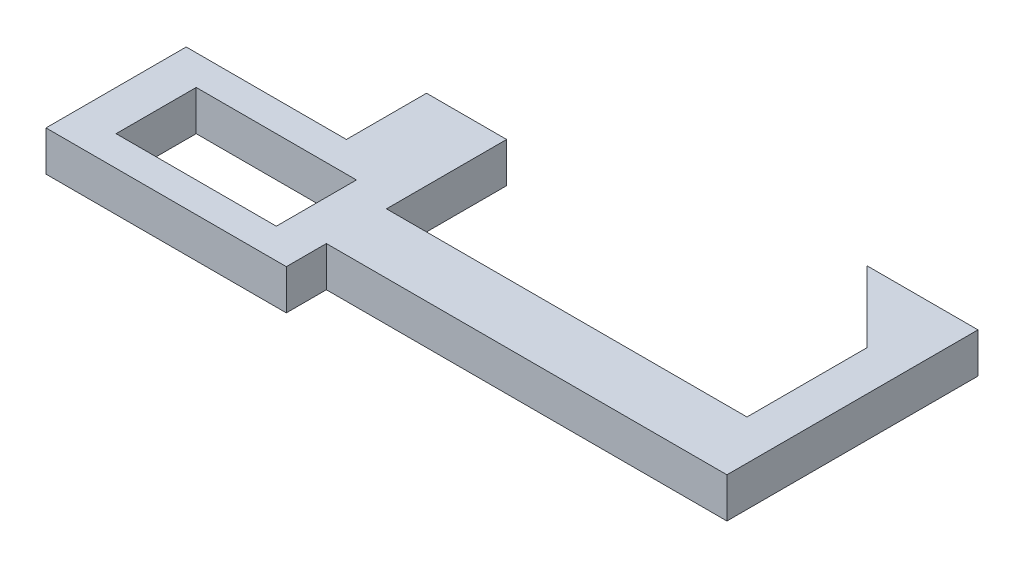
ISO-10303-21;
HEADER;
FILE_DESCRIPTION(('STEP AP214'),'2;1');
FILE_NAME('part.step','',(''),(''),'','','');
FILE_SCHEMA(('AUTOMOTIVE_DESIGN { 1 0 10303 214 1 1 1 1 }'));
ENDSEC;
DATA;
#1=APPLICATION_CONTEXT('core data for automotive mechanical design processes');
#2=APPLICATION_PROTOCOL_DEFINITION('international standard','automotive_design',2000,#1);
#3=PRODUCT_CONTEXT('',#1,'mechanical');
#4=PRODUCT('Part','Part','',(#3));
#5=PRODUCT_RELATED_PRODUCT_CATEGORY('part','',(#4));
#6=PRODUCT_DEFINITION_FORMATION('','',#4);
#7=PRODUCT_DEFINITION_CONTEXT('part definition',#1,'design');
#8=PRODUCT_DEFINITION('design','',#6,#7);
#9=PRODUCT_DEFINITION_SHAPE('','',#8);
#10=(LENGTH_UNIT() NAMED_UNIT(*) SI_UNIT(.MILLI.,.METRE.));
#11=(NAMED_UNIT(*) PLANE_ANGLE_UNIT() SI_UNIT($,.RADIAN.));
#12=(NAMED_UNIT(*) SI_UNIT($,.STERADIAN.) SOLID_ANGLE_UNIT());
#13=UNCERTAINTY_MEASURE_WITH_UNIT(LENGTH_MEASURE(1.E-05),#10,'distance_accuracy_value','');
#14=(GEOMETRIC_REPRESENTATION_CONTEXT(3) GLOBAL_UNCERTAINTY_ASSIGNED_CONTEXT((#13)) GLOBAL_UNIT_ASSIGNED_CONTEXT((#10,
#11,#12)) REPRESENTATION_CONTEXT('',''));
#15=CARTESIAN_POINT('',(0.,0.,0.));
#16=DIRECTION('',(0.,0.,1.));
#17=DIRECTION('',(1.,0.,0.));
#18=AXIS2_PLACEMENT_3D('',#15,#16,#17);
#19=CARTESIAN_POINT('',(0.,0.5,-22.6921827779806));
#20=DIRECTION('',(0.,0.,1.));
#21=DIRECTION('',(1.,0.,0.));
#22=AXIS2_PLACEMENT_3D('',#19,#20,#21);
#23=PLANE('',#22);
#24=DIRECTION('',(-1.,0.,0.));
#25=VECTOR('',#24,1.);
#26=CARTESIAN_POINT('',(0.,0.,-22.6921827779806));
#27=LINE('',#26,#25);
#28=CARTESIAN_POINT('',(-28.9732967707679,0.,-22.6921827779806));
#29=VERTEX_POINT('',#28);
#30=CARTESIAN_POINT('',(-30.9732967707679,0.,-22.6921827779806));
#31=VERTEX_POINT('',#30);
#32=EDGE_CURVE('E304',#29,#31,#27,.T.);
#33=ORIENTED_EDGE('',*,*,#32,.T.);
#34=DIRECTION('',(0.,-1.,0.));
#35=VECTOR('',#34,1.);
#36=CARTESIAN_POINT('',(-30.9732967707679,0.5,-22.6921827779806));
#37=LINE('',#36,#35);
#38=CARTESIAN_POINT('',(-30.9732967707679,0.5,-22.6921827779806));
#39=VERTEX_POINT('',#38);
#40=EDGE_CURVE('E11',#39,#31,#37,.T.);
#41=ORIENTED_EDGE('',*,*,#40,.F.);
#42=DIRECTION('',(-1.,0.,0.));
#43=VECTOR('',#42,1.);
#44=CARTESIAN_POINT('',(0.,0.5,-22.6921827779806));
#45=LINE('',#44,#43);
#46=CARTESIAN_POINT('',(-28.9732967707679,0.5,-22.6921827779806));
#47=VERTEX_POINT('',#46);
#48=EDGE_CURVE('E215',#47,#39,#45,.T.);
#49=ORIENTED_EDGE('',*,*,#48,.F.);
#50=DIRECTION('',(0.,-1.,0.));
#51=VECTOR('',#50,1.);
#52=CARTESIAN_POINT('',(-28.9732967707679,0.5,-22.6921827779806));
#53=LINE('',#52,#51);
#54=EDGE_CURVE('E239',#47,#29,#53,.T.);
#55=ORIENTED_EDGE('',*,*,#54,.T.);
#56=EDGE_LOOP('',(#33,#41,#49,#55));
#57=FACE_BOUND('',#56,.T.);
#58=ADVANCED_FACE('F41',(#57),#23,.F.);
#59=CARTESIAN_POINT('',(-30.9732967707679,0.5,0.));
#60=DIRECTION('',(-1.,0.,0.));
#61=DIRECTION('',(0.,0.,1.));
#62=AXIS2_PLACEMENT_3D('',#59,#60,#61);
#63=PLANE('',#62);
#64=DIRECTION('',(0.,0.,-1.));
#65=VECTOR('',#64,1.);
#66=CARTESIAN_POINT('',(-30.9732967707679,0.,0.));
#67=LINE('',#66,#65);
#68=CARTESIAN_POINT('',(-30.9732967707679,0.,-20.9421827779806));
#69=VERTEX_POINT('',#68);
#70=EDGE_CURVE('E308',#69,#31,#67,.T.);
#71=ORIENTED_EDGE('',*,*,#70,.F.);
#72=DIRECTION('',(0.,-1.,0.));
#73=VECTOR('',#72,1.);
#74=CARTESIAN_POINT('',(-30.9732967707679,0.5,-20.9421827779806));
#75=LINE('',#74,#73);
#76=CARTESIAN_POINT('',(-30.9732967707679,0.5,-20.9421827779806));
#77=VERTEX_POINT('',#76);
#78=EDGE_CURVE('E52',#77,#69,#75,.T.);
#79=ORIENTED_EDGE('',*,*,#78,.F.);
#80=DIRECTION('',(0.,0.,-1.));
#81=VECTOR('',#80,1.);
#82=CARTESIAN_POINT('',(-30.9732967707679,0.5,0.));
#83=LINE('',#82,#81);
#84=EDGE_CURVE('E210',#77,#39,#83,.T.);
#85=ORIENTED_EDGE('',*,*,#84,.T.);
#86=ORIENTED_EDGE('',*,*,#40,.T.);
#87=EDGE_LOOP('',(#71,#79,#85,#86));
#88=FACE_BOUND('',#87,.T.);
#89=ADVANCED_FACE('F367',(#88),#63,.T.);
#90=CARTESIAN_POINT('',(0.,0.5,-20.9421827779806));
#91=DIRECTION('',(0.,0.,1.));
#92=DIRECTION('',(1.,0.,0.));
#93=AXIS2_PLACEMENT_3D('',#90,#91,#92);
#94=PLANE('',#93);
#95=DIRECTION('',(-1.,0.,0.));
#96=VECTOR('',#95,1.);
#97=CARTESIAN_POINT('',(0.,0.,-20.9421827779806));
#98=LINE('',#97,#96);
#99=CARTESIAN_POINT('',(-27.9732967707679,0.,-20.9421827779806));
#100=VERTEX_POINT('',#99);
#101=EDGE_CURVE('E312',#100,#69,#98,.T.);
#102=ORIENTED_EDGE('',*,*,#101,.F.);
#103=DIRECTION('',(0.,-1.,0.));
#104=VECTOR('',#103,1.);
#105=CARTESIAN_POINT('',(-27.9732967707679,0.5,-20.9421827779806));
#106=LINE('',#105,#104);
#107=CARTESIAN_POINT('',(-27.9732967707679,0.5,-20.9421827779806));
#108=VERTEX_POINT('',#107);
#109=EDGE_CURVE('E264',#108,#100,#106,.T.);
#110=ORIENTED_EDGE('',*,*,#109,.F.);
#111=DIRECTION('',(-1.,0.,0.));
#112=VECTOR('',#111,1.);
#113=CARTESIAN_POINT('',(0.,0.5,-20.9421827779806));
#114=LINE('',#113,#112);
#115=EDGE_CURVE('E203',#108,#77,#114,.T.);
#116=ORIENTED_EDGE('',*,*,#115,.T.);
#117=ORIENTED_EDGE('',*,*,#78,.T.);
#118=EDGE_LOOP('',(#102,#110,#116,#117));
#119=FACE_BOUND('',#118,.T.);
#120=ADVANCED_FACE('F372',(#119),#94,.T.);
#121=CARTESIAN_POINT('',(-27.9732967707679,0.5,0.));
#122=DIRECTION('',(1.,0.,0.));
#123=DIRECTION('',(0.,0.,-1.));
#124=AXIS2_PLACEMENT_3D('',#121,#122,#123);
#125=PLANE('',#124);
#126=DIRECTION('',(0.,0.,1.));
#127=VECTOR('',#126,1.);
#128=CARTESIAN_POINT('',(-27.9732967707679,0.,0.));
#129=LINE('',#128,#127);
#130=CARTESIAN_POINT('',(-27.9732967707679,0.,-21.4421827779806));
#131=VERTEX_POINT('',#130);
#132=EDGE_CURVE('E316',#131,#100,#129,.T.);
#133=ORIENTED_EDGE('',*,*,#132,.F.);
#134=DIRECTION('',(0.,-1.,0.));
#135=VECTOR('',#134,1.);
#136=CARTESIAN_POINT('',(-27.9732967707679,0.5,-21.4421827779806));
#137=LINE('',#136,#135);
#138=CARTESIAN_POINT('',(-27.9732967707679,0.5,-21.4421827779806));
#139=VERTEX_POINT('',#138);
#140=EDGE_CURVE('E261',#139,#131,#137,.T.);
#141=ORIENTED_EDGE('',*,*,#140,.F.);
#142=DIRECTION('',(0.,0.,1.));
#143=VECTOR('',#142,1.);
#144=CARTESIAN_POINT('',(-27.9732967707679,0.5,0.));
#145=LINE('',#144,#143);
#146=EDGE_CURVE('E194',#139,#108,#145,.T.);
#147=ORIENTED_EDGE('',*,*,#146,.T.);
#148=ORIENTED_EDGE('',*,*,#109,.T.);
#149=EDGE_LOOP('',(#133,#141,#147,#148));
#150=FACE_BOUND('',#149,.T.);
#151=ADVANCED_FACE('F390',(#150),#125,.T.);
#152=CARTESIAN_POINT('',(0.,0.5,-21.4421827779806));
#153=DIRECTION('',(0.,0.,-1.));
#154=DIRECTION('',(-1.,0.,0.));
#155=AXIS2_PLACEMENT_3D('',#152,#153,#154);
#156=PLANE('',#155);
#157=DIRECTION('',(1.,0.,0.));
#158=VECTOR('',#157,1.);
#159=CARTESIAN_POINT('',(0.,0.,-21.4421827779806));
#160=LINE('',#159,#158);
#161=CARTESIAN_POINT('',(-22.9732967707679,0.,-21.4421827779806));
#162=VERTEX_POINT('',#161);
#163=EDGE_CURVE('E320',#131,#162,#160,.T.);
#164=ORIENTED_EDGE('',*,*,#163,.T.);
#165=DIRECTION('',(0.,-1.,0.));
#166=VECTOR('',#165,1.);
#167=CARTESIAN_POINT('',(-22.9732967707679,0.5,-21.4421827779806));
#168=LINE('',#167,#166);
#169=CARTESIAN_POINT('',(-22.9732967707679,0.5,-21.4421827779806));
#170=VERTEX_POINT('',#169);
#171=EDGE_CURVE('E258',#170,#162,#168,.T.);
#172=ORIENTED_EDGE('',*,*,#171,.F.);
#173=DIRECTION('',(1.,0.,0.));
#174=VECTOR('',#173,1.);
#175=CARTESIAN_POINT('',(0.,0.5,-21.4421827779806));
#176=LINE('',#175,#174);
#177=EDGE_CURVE('E202',#139,#170,#176,.T.);
#178=ORIENTED_EDGE('',*,*,#177,.F.);
#179=ORIENTED_EDGE('',*,*,#140,.T.);
#180=EDGE_LOOP('',(#164,#172,#178,#179));
#181=FACE_BOUND('',#180,.T.);
#182=ADVANCED_FACE('F410',(#181),#156,.F.);
#183=CARTESIAN_POINT('',(-22.9732967707679,0.5,0.));
#184=DIRECTION('',(1.,0.,0.));
#185=DIRECTION('',(0.,0.,-1.));
#186=AXIS2_PLACEMENT_3D('',#183,#184,#185);
#187=PLANE('',#186);
#188=DIRECTION('',(0.,0.,1.));
#189=VECTOR('',#188,1.);
#190=CARTESIAN_POINT('',(-22.9732967707679,0.,0.));
#191=LINE('',#190,#189);
#192=CARTESIAN_POINT('',(-22.9732967707679,0.,-24.5760662544638));
#193=VERTEX_POINT('',#192);
#194=EDGE_CURVE('E324',#193,#162,#191,.T.);
#195=ORIENTED_EDGE('',*,*,#194,.F.);
#196=DIRECTION('',(0.,-1.,0.));
#197=VECTOR('',#196,1.);
#198=CARTESIAN_POINT('',(-22.9732967707679,0.5,-24.5760662544638));
#199=LINE('',#198,#197);
#200=CARTESIAN_POINT('',(-22.9732967707679,0.5,-24.5760662544638));
#201=VERTEX_POINT('',#200);
#202=EDGE_CURVE('E255',#201,#193,#199,.T.);
#203=ORIENTED_EDGE('',*,*,#202,.F.);
#204=DIRECTION('',(0.,0.,1.));
#205=VECTOR('',#204,1.);
#206=CARTESIAN_POINT('',(-22.9732967707679,0.5,0.));
#207=LINE('',#206,#205);
#208=EDGE_CURVE('E208',#201,#170,#207,.T.);
#209=ORIENTED_EDGE('',*,*,#208,.T.);
#210=ORIENTED_EDGE('',*,*,#171,.T.);
#211=EDGE_LOOP('',(#195,#203,#209,#210));
#212=FACE_BOUND('',#211,.T.);
#213=ADVANCED_FACE('F406',(#212),#187,.T.);
#214=CARTESIAN_POINT('',(0.,0.5,-24.5760662544638));
#215=DIRECTION('',(0.,0.,-1.));
#216=DIRECTION('',(-1.,0.,0.));
#217=AXIS2_PLACEMENT_3D('',#214,#215,#216);
#218=PLANE('',#217);
#219=DIRECTION('',(1.,0.,0.));
#220=VECTOR('',#219,1.);
#221=CARTESIAN_POINT('',(0.,0.,-24.5760662544638));
#222=LINE('',#221,#220);
#223=CARTESIAN_POINT('',(-24.3571802472511,0.,-24.5760662544638));
#224=VERTEX_POINT('',#223);
#225=EDGE_CURVE('E328',#224,#193,#222,.T.);
#226=ORIENTED_EDGE('',*,*,#225,.F.);
#227=DIRECTION('',(0.,-1.,0.));
#228=VECTOR('',#227,1.);
#229=CARTESIAN_POINT('',(-24.3571802472511,0.5,-24.5760662544638));
#230=LINE('',#229,#228);
#231=CARTESIAN_POINT('',(-24.3571802472511,0.5,-24.5760662544638));
#232=VERTEX_POINT('',#231);
#233=EDGE_CURVE('E252',#232,#224,#230,.T.);
#234=ORIENTED_EDGE('',*,*,#233,.F.);
#235=DIRECTION('',(1.,0.,0.));
#236=VECTOR('',#235,1.);
#237=CARTESIAN_POINT('',(0.,0.5,-24.5760662544638));
#238=LINE('',#237,#236);
#239=EDGE_CURVE('E429',#232,#201,#238,.T.);
#240=ORIENTED_EDGE('',*,*,#239,.T.);
#241=ORIENTED_EDGE('',*,*,#202,.T.);
#242=EDGE_LOOP('',(#226,#234,#240,#241));
#243=FACE_BOUND('',#242,.T.);
#244=ADVANCED_FACE('F402',(#243),#218,.T.);
#245=CARTESIAN_POINT('',(0.10944300360635,0.5,-0.10944300360635));
#246=DIRECTION('',(-0.707106781186547,0.,0.707106781186547));
#247=DIRECTION('',(0.707106781186548,0.,0.707106781186548));
#248=AXIS2_PLACEMENT_3D('',#245,#246,#247);
#249=PLANE('',#248);
#250=DIRECTION('',(-0.707106781186548,0.,-0.707106781186548));
#251=VECTOR('',#250,1.);
#252=CARTESIAN_POINT('',(0.10944300360635,0.,-0.10944300360635));
#253=LINE('',#252,#251);
#254=CARTESIAN_POINT('',(-23.4732967707679,0.,-23.6921827779806));
#255=VERTEX_POINT('',#254);
#256=EDGE_CURVE('E332',#255,#224,#253,.T.);
#257=ORIENTED_EDGE('',*,*,#256,.F.);
#258=DIRECTION('',(0.,-1.,0.));
#259=VECTOR('',#258,1.);
#260=CARTESIAN_POINT('',(-23.4732967707679,0.5,-23.6921827779806));
#261=LINE('',#260,#259);
#262=CARTESIAN_POINT('',(-23.4732967707679,0.5,-23.6921827779806));
#263=VERTEX_POINT('',#262);
#264=EDGE_CURVE('E249',#263,#255,#261,.T.);
#265=ORIENTED_EDGE('',*,*,#264,.F.);
#266=DIRECTION('',(-0.707106781186548,0.,-0.707106781186548));
#267=VECTOR('',#266,1.);
#268=CARTESIAN_POINT('',(0.10944300360635,0.5,-0.10944300360635));
#269=LINE('',#268,#267);
#270=EDGE_CURVE('E436',#263,#232,#269,.T.);
#271=ORIENTED_EDGE('',*,*,#270,.T.);
#272=ORIENTED_EDGE('',*,*,#233,.T.);
#273=EDGE_LOOP('',(#257,#265,#271,#272));
#274=FACE_BOUND('',#273,.T.);
#275=ADVANCED_FACE('F398',(#274),#249,.T.);
#276=CARTESIAN_POINT('',(-23.4732967707679,0.5,0.));
#277=DIRECTION('',(-1.,0.,0.));
#278=DIRECTION('',(0.,0.,1.));
#279=AXIS2_PLACEMENT_3D('',#276,#277,#278);
#280=PLANE('',#279);
#281=DIRECTION('',(0.,0.,-1.));
#282=VECTOR('',#281,1.);
#283=CARTESIAN_POINT('',(-23.4732967707679,0.,0.));
#284=LINE('',#283,#282);
#285=CARTESIAN_POINT('',(-23.4732967707679,0.,-22.1921827779806));
#286=VERTEX_POINT('',#285);
#287=EDGE_CURVE('E336',#286,#255,#284,.T.);
#288=ORIENTED_EDGE('',*,*,#287,.F.);
#289=DIRECTION('',(0.,-1.,0.));
#290=VECTOR('',#289,1.);
#291=CARTESIAN_POINT('',(-23.4732967707679,0.5,-22.1921827779806));
#292=LINE('',#291,#290);
#293=CARTESIAN_POINT('',(-23.4732967707679,0.5,-22.1921827779806));
#294=VERTEX_POINT('',#293);
#295=EDGE_CURVE('E246',#294,#286,#292,.T.);
#296=ORIENTED_EDGE('',*,*,#295,.F.);
#297=DIRECTION('',(0.,0.,-1.));
#298=VECTOR('',#297,1.);
#299=CARTESIAN_POINT('',(-23.4732967707679,0.5,0.));
#300=LINE('',#299,#298);
#301=EDGE_CURVE('E196',#294,#263,#300,.T.);
#302=ORIENTED_EDGE('',*,*,#301,.T.);
#303=ORIENTED_EDGE('',*,*,#264,.T.);
#304=EDGE_LOOP('',(#288,#296,#302,#303));
#305=FACE_BOUND('',#304,.T.);
#306=ADVANCED_FACE('F394',(#305),#280,.T.);
#307=CARTESIAN_POINT('',(0.,0.5,-22.1921827779806));
#308=DIRECTION('',(0.,0.,-1.));
#309=DIRECTION('',(-1.,0.,0.));
#310=AXIS2_PLACEMENT_3D('',#307,#308,#309);
#311=PLANE('',#310);
#312=DIRECTION('',(1.,0.,0.));
#313=VECTOR('',#312,1.);
#314=CARTESIAN_POINT('',(0.,0.,-22.1921827779806));
#315=LINE('',#314,#313);
#316=CARTESIAN_POINT('',(-27.9732967707679,0.,-22.1921827779806));
#317=VERTEX_POINT('',#316);
#318=EDGE_CURVE('E339',#317,#286,#315,.T.);
#319=ORIENTED_EDGE('',*,*,#318,.F.);
#320=DIRECTION('',(0.,-1.,0.));
#321=VECTOR('',#320,1.);
#322=CARTESIAN_POINT('',(-27.9732967707679,0.5,-22.1921827779806));
#323=LINE('',#322,#321);
#324=CARTESIAN_POINT('',(-27.9732967707679,0.5,-22.1921827779806));
#325=VERTEX_POINT('',#324);
#326=EDGE_CURVE('E180',#325,#317,#323,.T.);
#327=ORIENTED_EDGE('',*,*,#326,.F.);
#328=DIRECTION('',(1.,0.,0.));
#329=VECTOR('',#328,1.);
#330=CARTESIAN_POINT('',(0.,0.5,-22.1921827779806));
#331=LINE('',#330,#329);
#332=EDGE_CURVE('E191',#325,#294,#331,.T.);
#333=ORIENTED_EDGE('',*,*,#332,.T.);
#334=ORIENTED_EDGE('',*,*,#295,.T.);
#335=EDGE_LOOP('',(#319,#327,#333,#334));
#336=FACE_BOUND('',#335,.T.);
#337=ADVANCED_FACE('F388',(#336),#311,.T.);
#338=CARTESIAN_POINT('',(-27.9732967707679,0.,-23.6921827779806));
#339=VERTEX_POINT('',#338);
#340=EDGE_CURVE('E178',#339,#317,#129,.T.);
#341=ORIENTED_EDGE('',*,*,#340,.F.);
#342=DIRECTION('',(0.,-1.,0.));
#343=VECTOR('',#342,1.);
#344=CARTESIAN_POINT('',(-27.9732967707679,0.5,-23.6921827779806));
#345=LINE('',#344,#343);
#346=CARTESIAN_POINT('',(-27.9732967707679,0.5,-23.6921827779806));
#347=VERTEX_POINT('',#346);
#348=EDGE_CURVE('E172',#347,#339,#345,.T.);
#349=ORIENTED_EDGE('',*,*,#348,.F.);
#350=EDGE_CURVE('E176',#347,#325,#145,.T.);
#351=ORIENTED_EDGE('',*,*,#350,.T.);
#352=ORIENTED_EDGE('',*,*,#326,.T.);
#353=EDGE_LOOP('',(#341,#349,#351,#352));
#354=FACE_BOUND('',#353,.T.);
#355=ADVANCED_FACE('F174',(#354),#125,.T.);
#356=CARTESIAN_POINT('',(0.,0.5,-23.6921827779806));
#357=DIRECTION('',(0.,0.,1.));
#358=DIRECTION('',(1.,0.,0.));
#359=AXIS2_PLACEMENT_3D('',#356,#357,#358);
#360=PLANE('',#359);
#361=DIRECTION('',(-1.,0.,0.));
#362=VECTOR('',#361,1.);
#363=CARTESIAN_POINT('',(0.,0.,-23.6921827779806));
#364=LINE('',#363,#362);
#365=CARTESIAN_POINT('',(-28.9732967707679,0.,-23.6921827779806));
#366=VERTEX_POINT('',#365);
#367=EDGE_CURVE('E115',#339,#366,#364,.T.);
#368=ORIENTED_EDGE('',*,*,#367,.T.);
#369=DIRECTION('',(0.,-1.,0.));
#370=VECTOR('',#369,1.);
#371=CARTESIAN_POINT('',(-28.9732967707679,0.5,-23.6921827779806));
#372=LINE('',#371,#370);
#373=CARTESIAN_POINT('',(-28.9732967707679,0.5,-23.6921827779806));
#374=VERTEX_POINT('',#373);
#375=EDGE_CURVE('E181',#374,#366,#372,.T.);
#376=ORIENTED_EDGE('',*,*,#375,.F.);
#377=DIRECTION('',(-1.,0.,0.));
#378=VECTOR('',#377,1.);
#379=CARTESIAN_POINT('',(0.,0.5,-23.6921827779806));
#380=LINE('',#379,#378);
#381=EDGE_CURVE('E183',#347,#374,#380,.T.);
#382=ORIENTED_EDGE('',*,*,#381,.F.);
#383=ORIENTED_EDGE('',*,*,#348,.T.);
#384=EDGE_LOOP('',(#368,#376,#382,#383));
#385=FACE_BOUND('',#384,.T.);
#386=ADVANCED_FACE('F184',(#385),#360,.F.);
#387=CARTESIAN_POINT('',(0.,0.5,-21.3171827779806));
#388=DIRECTION('',(0.,0.,1.));
#389=DIRECTION('',(1.,0.,0.));
#390=AXIS2_PLACEMENT_3D('',#387,#388,#389);
#391=PLANE('',#390);
#392=DIRECTION('',(-1.,0.,0.));
#393=VECTOR('',#392,1.);
#394=CARTESIAN_POINT('',(0.,0.,-21.3171827779806));
#395=LINE('',#394,#393);
#396=CARTESIAN_POINT('',(-28.4732967707679,0.,-21.3171827779806));
#397=VERTEX_POINT('',#396);
#398=CARTESIAN_POINT('',(-30.4732967707679,0.,-21.3171827779806));
#399=VERTEX_POINT('',#398);
#400=EDGE_CURVE('E288',#397,#399,#395,.T.);
#401=ORIENTED_EDGE('',*,*,#400,.T.);
#402=DIRECTION('',(0.,-1.,0.));
#403=VECTOR('',#402,1.);
#404=CARTESIAN_POINT('',(-30.4732967707679,0.5,-21.3171827779806));
#405=LINE('',#404,#403);
#406=CARTESIAN_POINT('',(-30.4732967707679,0.5,-21.3171827779806));
#407=VERTEX_POINT('',#406);
#408=EDGE_CURVE('E45',#407,#399,#405,.T.);
#409=ORIENTED_EDGE('',*,*,#408,.F.);
#410=DIRECTION('',(-1.,0.,0.));
#411=VECTOR('',#410,1.);
#412=CARTESIAN_POINT('',(0.,0.5,-21.3171827779806));
#413=LINE('',#412,#411);
#414=CARTESIAN_POINT('',(-28.4732967707679,0.5,-21.3171827779806));
#415=VERTEX_POINT('',#414);
#416=EDGE_CURVE('E228',#415,#407,#413,.T.);
#417=ORIENTED_EDGE('',*,*,#416,.F.);
#418=DIRECTION('',(0.,-1.,0.));
#419=VECTOR('',#418,1.);
#420=CARTESIAN_POINT('',(-28.4732967707679,0.5,-21.3171827779806));
#421=LINE('',#420,#419);
#422=EDGE_CURVE('E269',#415,#397,#421,.T.);
#423=ORIENTED_EDGE('',*,*,#422,.T.);
#424=EDGE_LOOP('',(#401,#409,#417,#423));
#425=FACE_BOUND('',#424,.T.);
#426=ADVANCED_FACE('F43',(#425),#391,.F.);
#427=CARTESIAN_POINT('',(-30.4732967707679,0.5,0.));
#428=DIRECTION('',(-1.,0.,0.));
#429=DIRECTION('',(0.,0.,1.));
#430=AXIS2_PLACEMENT_3D('',#427,#428,#429);
#431=PLANE('',#430);
#432=DIRECTION('',(0.,0.,-1.));
#433=VECTOR('',#432,1.);
#434=CARTESIAN_POINT('',(-30.4732967707679,0.,0.));
#435=LINE('',#434,#433);
#436=CARTESIAN_POINT('',(-30.4732967707679,0.,-22.3171827779806));
#437=VERTEX_POINT('',#436);
#438=EDGE_CURVE('E285',#399,#437,#435,.T.);
#439=ORIENTED_EDGE('',*,*,#438,.T.);
#440=DIRECTION('',(0.,-1.,0.));
#441=VECTOR('',#440,1.);
#442=CARTESIAN_POINT('',(-30.4732967707679,0.5,-22.3171827779806));
#443=LINE('',#442,#441);
#444=CARTESIAN_POINT('',(-30.4732967707679,0.5,-22.3171827779806));
#445=VERTEX_POINT('',#444);
#446=EDGE_CURVE('E276',#445,#437,#443,.T.);
#447=ORIENTED_EDGE('',*,*,#446,.F.);
#448=DIRECTION('',(0.,0.,-1.));
#449=VECTOR('',#448,1.);
#450=CARTESIAN_POINT('',(-30.4732967707679,0.5,0.));
#451=LINE('',#450,#449);
#452=EDGE_CURVE('E130',#407,#445,#451,.T.);
#453=ORIENTED_EDGE('',*,*,#452,.F.);
#454=ORIENTED_EDGE('',*,*,#408,.T.);
#455=EDGE_LOOP('',(#439,#447,#453,#454));
#456=FACE_BOUND('',#455,.T.);
#457=ADVANCED_FACE('F284',(#456),#431,.F.);
#458=CARTESIAN_POINT('',(0.,0.5,-22.3171827779806));
#459=DIRECTION('',(0.,0.,-1.));
#460=DIRECTION('',(-1.,0.,0.));
#461=AXIS2_PLACEMENT_3D('',#458,#459,#460);
#462=PLANE('',#461);
#463=DIRECTION('',(1.,0.,0.));
#464=VECTOR('',#463,1.);
#465=CARTESIAN_POINT('',(0.,0.,-22.3171827779806));
#466=LINE('',#465,#464);
#467=CARTESIAN_POINT('',(-28.4732967707679,0.,-22.3171827779806));
#468=VERTEX_POINT('',#467);
#469=EDGE_CURVE('E295',#437,#468,#466,.T.);
#470=ORIENTED_EDGE('',*,*,#469,.T.);
#471=DIRECTION('',(0.,-1.,0.));
#472=VECTOR('',#471,1.);
#473=CARTESIAN_POINT('',(-28.4732967707679,0.5,-22.3171827779806));
#474=LINE('',#473,#472);
#475=CARTESIAN_POINT('',(-28.4732967707679,0.5,-22.3171827779806));
#476=VERTEX_POINT('',#475);
#477=EDGE_CURVE('E273',#476,#468,#474,.T.);
#478=ORIENTED_EDGE('',*,*,#477,.F.);
#479=DIRECTION('',(1.,0.,0.));
#480=VECTOR('',#479,1.);
#481=CARTESIAN_POINT('',(0.,0.5,-22.3171827779806));
#482=LINE('',#481,#480);
#483=EDGE_CURVE('E223',#445,#476,#482,.T.);
#484=ORIENTED_EDGE('',*,*,#483,.F.);
#485=ORIENTED_EDGE('',*,*,#446,.T.);
#486=EDGE_LOOP('',(#470,#478,#484,#485));
#487=FACE_BOUND('',#486,.T.);
#488=ADVANCED_FACE('F361',(#487),#462,.F.);
#489=CARTESIAN_POINT('',(-28.4732967707679,0.5,0.));
#490=DIRECTION('',(1.,0.,0.));
#491=DIRECTION('',(0.,0.,-1.));
#492=AXIS2_PLACEMENT_3D('',#489,#490,#491);
#493=PLANE('',#492);
#494=DIRECTION('',(0.,0.,1.));
#495=VECTOR('',#494,1.);
#496=CARTESIAN_POINT('',(-28.4732967707679,0.,0.));
#497=LINE('',#496,#495);
#498=EDGE_CURVE('E301',#468,#397,#497,.T.);
#499=ORIENTED_EDGE('',*,*,#498,.T.);
#500=ORIENTED_EDGE('',*,*,#422,.F.);
#501=DIRECTION('',(0.,0.,1.));
#502=VECTOR('',#501,1.);
#503=CARTESIAN_POINT('',(-28.4732967707679,0.5,0.));
#504=LINE('',#503,#502);
#505=EDGE_CURVE('E220',#476,#415,#504,.T.);
#506=ORIENTED_EDGE('',*,*,#505,.F.);
#507=ORIENTED_EDGE('',*,*,#477,.T.);
#508=EDGE_LOOP('',(#499,#500,#506,#507));
#509=FACE_BOUND('',#508,.T.);
#510=ADVANCED_FACE('F354',(#509),#493,.F.);
#511=CARTESIAN_POINT('',(-28.9732967707679,0.5,0.));
#512=DIRECTION('',(1.,0.,0.));
#513=DIRECTION('',(0.,0.,-1.));
#514=AXIS2_PLACEMENT_3D('',#511,#512,#513);
#515=PLANE('',#514);
#516=DIRECTION('',(0.,0.,1.));
#517=VECTOR('',#516,1.);
#518=CARTESIAN_POINT('',(-28.9732967707679,0.,0.));
#519=LINE('',#518,#517);
#520=EDGE_CURVE('E121',#366,#29,#519,.T.);
#521=ORIENTED_EDGE('',*,*,#520,.T.);
#522=ORIENTED_EDGE('',*,*,#54,.F.);
#523=DIRECTION('',(0.,0.,1.));
#524=VECTOR('',#523,1.);
#525=CARTESIAN_POINT('',(-28.9732967707679,0.5,0.));
#526=LINE('',#525,#524);
#527=EDGE_CURVE('E61',#374,#47,#526,.T.);
#528=ORIENTED_EDGE('',*,*,#527,.F.);
#529=ORIENTED_EDGE('',*,*,#375,.T.);
#530=EDGE_LOOP('',(#521,#522,#528,#529));
#531=FACE_BOUND('',#530,.T.);
#532=ADVANCED_FACE('F351',(#531),#515,.F.);
#533=CARTESIAN_POINT('',(0.,0.5,0.));
#534=DIRECTION('',(0.,1.,0.));
#535=DIRECTION('',(0.,0.,1.));
#536=AXIS2_PLACEMENT_3D('',#533,#534,#535);
#537=PLANE('',#536);
#538=ORIENTED_EDGE('',*,*,#416,.T.);
#539=ORIENTED_EDGE('',*,*,#452,.T.);
#540=ORIENTED_EDGE('',*,*,#483,.T.);
#541=ORIENTED_EDGE('',*,*,#505,.T.);
#542=EDGE_LOOP('',(#538,#539,#540,#541));
#543=FACE_BOUND('',#542,.T.);
#544=ORIENTED_EDGE('',*,*,#48,.T.);
#545=ORIENTED_EDGE('',*,*,#84,.F.);
#546=ORIENTED_EDGE('',*,*,#115,.F.);
#547=ORIENTED_EDGE('',*,*,#146,.F.);
#548=ORIENTED_EDGE('',*,*,#177,.T.);
#549=ORIENTED_EDGE('',*,*,#208,.F.);
#550=ORIENTED_EDGE('',*,*,#239,.F.);
#551=ORIENTED_EDGE('',*,*,#270,.F.);
#552=ORIENTED_EDGE('',*,*,#301,.F.);
#553=ORIENTED_EDGE('',*,*,#332,.F.);
#554=ORIENTED_EDGE('',*,*,#350,.F.);
#555=ORIENTED_EDGE('',*,*,#381,.T.);
#556=ORIENTED_EDGE('',*,*,#527,.T.);
#557=EDGE_LOOP('',(#544,#545,#546,#547,#548,#549,#550,#551,#552,#553,#554,#555,#556));
#558=FACE_BOUND('',#557,.T.);
#559=ADVANCED_FACE('F188',(#543,#558),#537,.T.);
#560=CARTESIAN_POINT('',(0.,0.,0.));
#561=DIRECTION('',(0.,1.,0.));
#562=DIRECTION('',(0.,0.,1.));
#563=AXIS2_PLACEMENT_3D('',#560,#561,#562);
#564=PLANE('',#563);
#565=ORIENTED_EDGE('',*,*,#400,.F.);
#566=ORIENTED_EDGE('',*,*,#498,.F.);
#567=ORIENTED_EDGE('',*,*,#469,.F.);
#568=ORIENTED_EDGE('',*,*,#438,.F.);
#569=EDGE_LOOP('',(#565,#566,#567,#568));
#570=FACE_BOUND('',#569,.T.);
#571=ORIENTED_EDGE('',*,*,#32,.F.);
#572=ORIENTED_EDGE('',*,*,#520,.F.);
#573=ORIENTED_EDGE('',*,*,#367,.F.);
#574=ORIENTED_EDGE('',*,*,#340,.T.);
#575=ORIENTED_EDGE('',*,*,#318,.T.);
#576=ORIENTED_EDGE('',*,*,#287,.T.);
#577=ORIENTED_EDGE('',*,*,#256,.T.);
#578=ORIENTED_EDGE('',*,*,#225,.T.);
#579=ORIENTED_EDGE('',*,*,#194,.T.);
#580=ORIENTED_EDGE('',*,*,#163,.F.);
#581=ORIENTED_EDGE('',*,*,#132,.T.);
#582=ORIENTED_EDGE('',*,*,#101,.T.);
#583=ORIENTED_EDGE('',*,*,#70,.T.);
#584=EDGE_LOOP('',(#571,#572,#573,#574,#575,#576,#577,#578,#579,#580,#581,#582,#583));
#585=FACE_BOUND('',#584,.T.);
#586=ADVANCED_FACE('F346',(#570,#585),#564,.F.);
#587=CLOSED_SHELL('',(#58,#89,#120,#151,#182,#213,#244,#275,#306,#337,#355,#386,#426,#457,#488,
#510,#532,#559,#586));
#588=MANIFOLD_SOLID_BREP('B2',#587);
#589=ADVANCED_BREP_SHAPE_REPRESENTATION('',(#18,#588),#14);
#590=SHAPE_DEFINITION_REPRESENTATION(#9,#589);
ENDSEC;
END-ISO-10303-21;
